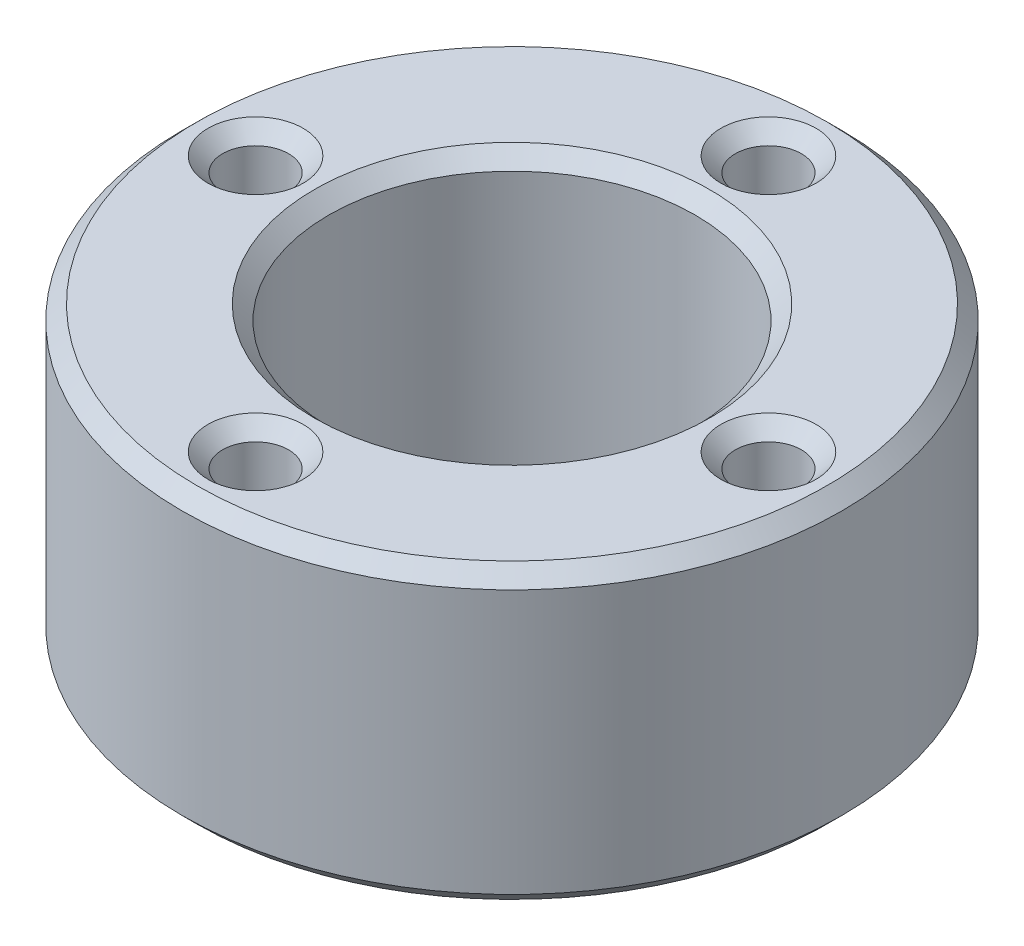
ISO-10303-21;
HEADER;
FILE_DESCRIPTION(('STEP AP214'),'2;1');
FILE_NAME('part.step','',(''),(''),'','','');
FILE_SCHEMA(('AUTOMOTIVE_DESIGN { 1 0 10303 214 1 1 1 1 }'));
ENDSEC;
DATA;
#1=APPLICATION_CONTEXT('core data for automotive mechanical design processes');
#2=APPLICATION_PROTOCOL_DEFINITION('international standard','automotive_design',2000,#1);
#3=PRODUCT_CONTEXT('',#1,'mechanical');
#4=PRODUCT('Part','Part','',(#3));
#5=PRODUCT_RELATED_PRODUCT_CATEGORY('part','',(#4));
#6=PRODUCT_DEFINITION_FORMATION('','',#4);
#7=PRODUCT_DEFINITION_CONTEXT('part definition',#1,'design');
#8=PRODUCT_DEFINITION('design','',#6,#7);
#9=PRODUCT_DEFINITION_SHAPE('','',#8);
#10=(LENGTH_UNIT() NAMED_UNIT(*) SI_UNIT(.MILLI.,.METRE.));
#11=(NAMED_UNIT(*) PLANE_ANGLE_UNIT() SI_UNIT($,.RADIAN.));
#12=(NAMED_UNIT(*) SI_UNIT($,.STERADIAN.) SOLID_ANGLE_UNIT());
#13=UNCERTAINTY_MEASURE_WITH_UNIT(LENGTH_MEASURE(1.E-05),#10,'distance_accuracy_value','');
#14=(GEOMETRIC_REPRESENTATION_CONTEXT(3) GLOBAL_UNCERTAINTY_ASSIGNED_CONTEXT((#13)) GLOBAL_UNIT_ASSIGNED_CONTEXT((#10,
#11,#12)) REPRESENTATION_CONTEXT('',''));
#15=CARTESIAN_POINT('',(0.,0.,0.));
#16=DIRECTION('',(0.,0.,1.));
#17=DIRECTION('',(1.,0.,0.));
#18=AXIS2_PLACEMENT_3D('',#15,#16,#17);
#19=CARTESIAN_POINT('',(0.,20.,0.));
#20=DIRECTION('',(0.,1.,0.));
#21=DIRECTION('',(0.,0.,1.));
#22=AXIS2_PLACEMENT_3D('',#19,#20,#21);
#23=PLANE('',#22);
#24=CARTESIAN_POINT('',(0.,20.,17.5));
#25=DIRECTION('',(0.,1.,0.));
#26=DIRECTION('',(0.,0.,1.));
#27=AXIS2_PLACEMENT_3D('',#24,#25,#26);
#28=CIRCLE('',#27,3.25000000000006);
#29=CARTESIAN_POINT('',(0.,20.,20.7500000000001));
#30=VERTEX_POINT('',#29);
#31=EDGE_CURVE('E10',#30,#30,#28,.F.);
#32=ORIENTED_EDGE('',*,*,#31,.T.);
#33=EDGE_LOOP('',(#32));
#34=FACE_BOUND('',#33,.T.);
#35=CARTESIAN_POINT('',(0.,20.,-17.5));
#36=DIRECTION('',(0.,1.,0.));
#37=DIRECTION('',(0.,0.,1.));
#38=AXIS2_PLACEMENT_3D('',#35,#36,#37);
#39=CIRCLE('',#38,3.25000000000002);
#40=CARTESIAN_POINT('',(0.,20.,-14.25));
#41=VERTEX_POINT('',#40);
#42=EDGE_CURVE('E48',#41,#41,#39,.F.);
#43=ORIENTED_EDGE('',*,*,#42,.T.);
#44=EDGE_LOOP('',(#43));
#45=FACE_BOUND('',#44,.T.);
#46=CARTESIAN_POINT('',(-17.5,20.,0.));
#47=DIRECTION('',(0.,1.,0.));
#48=DIRECTION('',(0.,0.,1.));
#49=AXIS2_PLACEMENT_3D('',#46,#47,#48);
#50=CIRCLE('',#49,3.25);
#51=CARTESIAN_POINT('',(-17.5,20.,3.25));
#52=VERTEX_POINT('',#51);
#53=EDGE_CURVE('E53',#52,#52,#50,.F.);
#54=ORIENTED_EDGE('',*,*,#53,.T.);
#55=EDGE_LOOP('',(#54));
#56=FACE_BOUND('',#55,.T.);
#57=CARTESIAN_POINT('',(0.,20.,0.));
#58=DIRECTION('',(0.,1.,0.));
#59=DIRECTION('',(0.,0.,1.));
#60=AXIS2_PLACEMENT_3D('',#57,#58,#59);
#61=CIRCLE('',#60,21.5);
#62=CARTESIAN_POINT('',(0.,20.,21.5));
#63=VERTEX_POINT('',#62);
#64=EDGE_CURVE('E58',#63,#63,#61,.T.);
#65=ORIENTED_EDGE('',*,*,#64,.T.);
#66=EDGE_LOOP('',(#65));
#67=FACE_BOUND('',#66,.T.);
#68=CARTESIAN_POINT('',(0.,20.,0.));
#69=DIRECTION('',(0.,1.,0.));
#70=DIRECTION('',(0.,0.,1.));
#71=AXIS2_PLACEMENT_3D('',#68,#69,#70);
#72=CIRCLE('',#71,13.5);
#73=CARTESIAN_POINT('',(0.,20.,13.5));
#74=VERTEX_POINT('',#73);
#75=EDGE_CURVE('E64',#74,#74,#72,.F.);
#76=ORIENTED_EDGE('',*,*,#75,.T.);
#77=EDGE_LOOP('',(#76));
#78=FACE_BOUND('',#77,.T.);
#79=CARTESIAN_POINT('',(17.5,20.,1.2220184685951E-13));
#80=DIRECTION('',(0.,1.,0.));
#81=DIRECTION('',(0.,0.,1.));
#82=AXIS2_PLACEMENT_3D('',#79,#80,#81);
#83=CIRCLE('',#82,3.25000000000002);
#84=CARTESIAN_POINT('',(17.5,20.,3.25000000000015));
#85=VERTEX_POINT('',#84);
#86=EDGE_CURVE('E68',#85,#85,#83,.F.);
#87=ORIENTED_EDGE('',*,*,#86,.T.);
#88=EDGE_LOOP('',(#87));
#89=FACE_BOUND('',#88,.T.);
#90=ADVANCED_FACE('F39',(#34,#45,#56,#67,#78,#89),#23,.T.);
#91=CARTESIAN_POINT('',(0.,0.,0.));
#92=DIRECTION('',(0.,1.,0.));
#93=DIRECTION('',(0.,0.,1.));
#94=AXIS2_PLACEMENT_3D('',#91,#92,#93);
#95=PLANE('',#94);
#96=CARTESIAN_POINT('',(0.,0.,17.5));
#97=DIRECTION('',(0.,1.,0.));
#98=DIRECTION('',(0.,0.,1.));
#99=AXIS2_PLACEMENT_3D('',#96,#97,#98);
#100=CIRCLE('',#99,3.25000000000007);
#101=CARTESIAN_POINT('',(0.,0.,20.7500000000001));
#102=VERTEX_POINT('',#101);
#103=EDGE_CURVE('E120',#102,#102,#100,.T.);
#104=ORIENTED_EDGE('',*,*,#103,.T.);
#105=EDGE_LOOP('',(#104));
#106=FACE_BOUND('',#105,.T.);
#107=CARTESIAN_POINT('',(17.5,0.,1.2220184685951E-13));
#108=DIRECTION('',(0.,1.,0.));
#109=DIRECTION('',(0.,0.,1.));
#110=AXIS2_PLACEMENT_3D('',#107,#108,#109);
#111=CIRCLE('',#110,3.25000000000002);
#112=CARTESIAN_POINT('',(17.5,0.,3.25000000000014));
#113=VERTEX_POINT('',#112);
#114=EDGE_CURVE('E124',#113,#113,#111,.T.);
#115=ORIENTED_EDGE('',*,*,#114,.T.);
#116=EDGE_LOOP('',(#115));
#117=FACE_BOUND('',#116,.T.);
#118=CARTESIAN_POINT('',(0.,0.,-17.5));
#119=DIRECTION('',(0.,1.,0.));
#120=DIRECTION('',(0.,0.,1.));
#121=AXIS2_PLACEMENT_3D('',#118,#119,#120);
#122=CIRCLE('',#121,3.25000000000004);
#123=CARTESIAN_POINT('',(0.,0.,-14.25));
#124=VERTEX_POINT('',#123);
#125=EDGE_CURVE('E128',#124,#124,#122,.T.);
#126=ORIENTED_EDGE('',*,*,#125,.T.);
#127=EDGE_LOOP('',(#126));
#128=FACE_BOUND('',#127,.T.);
#129=CARTESIAN_POINT('',(0.,0.,0.));
#130=DIRECTION('',(0.,1.,0.));
#131=DIRECTION('',(0.,0.,1.));
#132=AXIS2_PLACEMENT_3D('',#129,#130,#131);
#133=CIRCLE('',#132,13.5);
#134=CARTESIAN_POINT('',(0.,0.,13.5));
#135=VERTEX_POINT('',#134);
#136=EDGE_CURVE('E132',#135,#135,#133,.T.);
#137=ORIENTED_EDGE('',*,*,#136,.T.);
#138=EDGE_LOOP('',(#137));
#139=FACE_BOUND('',#138,.T.);
#140=CARTESIAN_POINT('',(-17.5,0.,0.));
#141=DIRECTION('',(0.,1.,0.));
#142=DIRECTION('',(0.,0.,1.));
#143=AXIS2_PLACEMENT_3D('',#140,#141,#142);
#144=CIRCLE('',#143,3.25000000000002);
#145=CARTESIAN_POINT('',(-17.5,0.,3.25000000000002));
#146=VERTEX_POINT('',#145);
#147=EDGE_CURVE('E136',#146,#146,#144,.T.);
#148=ORIENTED_EDGE('',*,*,#147,.T.);
#149=EDGE_LOOP('',(#148));
#150=FACE_BOUND('',#149,.T.);
#151=CARTESIAN_POINT('',(0.,0.,0.));
#152=DIRECTION('',(0.,1.,0.));
#153=DIRECTION('',(0.,0.,1.));
#154=AXIS2_PLACEMENT_3D('',#151,#152,#153);
#155=CIRCLE('',#154,21.5);
#156=CARTESIAN_POINT('',(0.,0.,21.5));
#157=VERTEX_POINT('',#156);
#158=EDGE_CURVE('E140',#157,#157,#155,.F.);
#159=ORIENTED_EDGE('',*,*,#158,.T.);
#160=EDGE_LOOP('',(#159));
#161=FACE_BOUND('',#160,.T.);
#162=ADVANCED_FACE('F145',(#106,#117,#128,#139,#150,#161),#95,.F.);
#163=CARTESIAN_POINT('',(0.,20.,0.));
#164=DIRECTION('',(0.,-1.,0.));
#165=DIRECTION('',(0.,0.,-1.));
#166=AXIS2_PLACEMENT_3D('',#163,#164,#165);
#167=CYLINDRICAL_SURFACE('',#166,22.5);
#168=CARTESIAN_POINT('',(0.,1.,0.));
#169=DIRECTION('',(0.,1.,0.));
#170=DIRECTION('',(0.,0.,1.));
#171=AXIS2_PLACEMENT_3D('',#168,#169,#170);
#172=CIRCLE('',#171,22.5);
#173=CARTESIAN_POINT('',(0.,1.,22.5));
#174=VERTEX_POINT('',#173);
#175=EDGE_CURVE('E72',#174,#174,#172,.T.);
#176=ORIENTED_EDGE('',*,*,#175,.T.);
#177=EDGE_LOOP('',(#176));
#178=FACE_BOUND('',#177,.T.);
#179=CARTESIAN_POINT('',(0.,19.,0.));
#180=DIRECTION('',(0.,1.,0.));
#181=DIRECTION('',(0.,0.,1.));
#182=AXIS2_PLACEMENT_3D('',#179,#180,#181);
#183=CIRCLE('',#182,22.5);
#184=CARTESIAN_POINT('',(0.,19.,22.5));
#185=VERTEX_POINT('',#184);
#186=EDGE_CURVE('E76',#185,#185,#183,.F.);
#187=ORIENTED_EDGE('',*,*,#186,.T.);
#188=EDGE_LOOP('',(#187));
#189=FACE_BOUND('',#188,.T.);
#190=ADVANCED_FACE('F155',(#178,#189),#167,.T.);
#191=CARTESIAN_POINT('',(-17.5,20.,0.));
#192=DIRECTION('',(0.,-1.,0.));
#193=DIRECTION('',(0.,0.,-1.));
#194=AXIS2_PLACEMENT_3D('',#191,#192,#193);
#195=CYLINDRICAL_SURFACE('',#194,2.25);
#196=CARTESIAN_POINT('',(-17.5,1.00000000000002,0.));
#197=DIRECTION('',(0.,1.,0.));
#198=DIRECTION('',(0.,0.,1.));
#199=AXIS2_PLACEMENT_3D('',#196,#197,#198);
#200=CIRCLE('',#199,2.25);
#201=CARTESIAN_POINT('',(-17.5,1.00000000000002,2.25));
#202=VERTEX_POINT('',#201);
#203=EDGE_CURVE('E80',#202,#202,#200,.F.);
#204=ORIENTED_EDGE('',*,*,#203,.T.);
#205=EDGE_LOOP('',(#204));
#206=FACE_BOUND('',#205,.T.);
#207=CARTESIAN_POINT('',(-17.5,19.,0.));
#208=DIRECTION('',(0.,1.,0.));
#209=DIRECTION('',(0.,0.,1.));
#210=AXIS2_PLACEMENT_3D('',#207,#208,#209);
#211=CIRCLE('',#210,2.25);
#212=CARTESIAN_POINT('',(-17.5,19.,2.25));
#213=VERTEX_POINT('',#212);
#214=EDGE_CURVE('E84',#213,#213,#211,.T.);
#215=ORIENTED_EDGE('',*,*,#214,.T.);
#216=EDGE_LOOP('',(#215));
#217=FACE_BOUND('',#216,.T.);
#218=ADVANCED_FACE('F158',(#206,#217),#195,.F.);
#219=CARTESIAN_POINT('',(0.,20.,0.));
#220=DIRECTION('',(0.,-1.,0.));
#221=DIRECTION('',(0.,0.,-1.));
#222=AXIS2_PLACEMENT_3D('',#219,#220,#221);
#223=CYLINDRICAL_SURFACE('',#222,12.5);
#224=CARTESIAN_POINT('',(0.,1.00000000000001,0.));
#225=DIRECTION('',(0.,1.,0.));
#226=DIRECTION('',(0.,0.,1.));
#227=AXIS2_PLACEMENT_3D('',#224,#225,#226);
#228=CIRCLE('',#227,12.5);
#229=CARTESIAN_POINT('',(0.,1.00000000000001,12.5));
#230=VERTEX_POINT('',#229);
#231=EDGE_CURVE('E88',#230,#230,#228,.F.);
#232=ORIENTED_EDGE('',*,*,#231,.T.);
#233=EDGE_LOOP('',(#232));
#234=FACE_BOUND('',#233,.T.);
#235=CARTESIAN_POINT('',(0.,19.,0.));
#236=DIRECTION('',(0.,1.,0.));
#237=DIRECTION('',(0.,0.,1.));
#238=AXIS2_PLACEMENT_3D('',#235,#236,#237);
#239=CIRCLE('',#238,12.5);
#240=CARTESIAN_POINT('',(0.,19.,12.5));
#241=VERTEX_POINT('',#240);
#242=EDGE_CURVE('E92',#241,#241,#239,.T.);
#243=ORIENTED_EDGE('',*,*,#242,.T.);
#244=EDGE_LOOP('',(#243));
#245=FACE_BOUND('',#244,.T.);
#246=ADVANCED_FACE('F194',(#234,#245),#223,.F.);
#247=CARTESIAN_POINT('',(0.,20.,-17.5));
#248=DIRECTION('',(0.,-1.,0.));
#249=DIRECTION('',(0.,0.,-1.));
#250=AXIS2_PLACEMENT_3D('',#247,#248,#249);
#251=CYLINDRICAL_SURFACE('',#250,2.25000000000002);
#252=CARTESIAN_POINT('',(0.,1.00000000000002,-17.5));
#253=DIRECTION('',(0.,1.,0.));
#254=DIRECTION('',(0.,0.,1.));
#255=AXIS2_PLACEMENT_3D('',#252,#253,#254);
#256=CIRCLE('',#255,2.25000000000002);
#257=CARTESIAN_POINT('',(0.,1.00000000000002,-15.25));
#258=VERTEX_POINT('',#257);
#259=EDGE_CURVE('E96',#258,#258,#256,.F.);
#260=ORIENTED_EDGE('',*,*,#259,.T.);
#261=EDGE_LOOP('',(#260));
#262=FACE_BOUND('',#261,.T.);
#263=CARTESIAN_POINT('',(0.,19.,-17.5));
#264=DIRECTION('',(0.,1.,0.));
#265=DIRECTION('',(0.,0.,1.));
#266=AXIS2_PLACEMENT_3D('',#263,#264,#265);
#267=CIRCLE('',#266,2.25000000000002);
#268=CARTESIAN_POINT('',(0.,19.,-15.25));
#269=VERTEX_POINT('',#268);
#270=EDGE_CURVE('E100',#269,#269,#267,.T.);
#271=ORIENTED_EDGE('',*,*,#270,.T.);
#272=EDGE_LOOP('',(#271));
#273=FACE_BOUND('',#272,.T.);
#274=ADVANCED_FACE('F184',(#262,#273),#251,.F.);
#275=CARTESIAN_POINT('',(17.5,20.,1.2220184685951E-13));
#276=DIRECTION('',(0.,-1.,0.));
#277=DIRECTION('',(0.,0.,-1.));
#278=AXIS2_PLACEMENT_3D('',#275,#276,#277);
#279=CYLINDRICAL_SURFACE('',#278,2.25);
#280=CARTESIAN_POINT('',(17.5,1.00000000000002,1.2220184685951E-13));
#281=DIRECTION('',(0.,1.,0.));
#282=DIRECTION('',(0.,0.,1.));
#283=AXIS2_PLACEMENT_3D('',#280,#281,#282);
#284=CIRCLE('',#283,2.25);
#285=CARTESIAN_POINT('',(17.5,1.00000000000002,2.25000000000012));
#286=VERTEX_POINT('',#285);
#287=EDGE_CURVE('E104',#286,#286,#284,.F.);
#288=ORIENTED_EDGE('',*,*,#287,.T.);
#289=EDGE_LOOP('',(#288));
#290=FACE_BOUND('',#289,.T.);
#291=CARTESIAN_POINT('',(17.5,19.,1.2220184685951E-13));
#292=DIRECTION('',(0.,1.,0.));
#293=DIRECTION('',(0.,0.,1.));
#294=AXIS2_PLACEMENT_3D('',#291,#292,#293);
#295=CIRCLE('',#294,2.25);
#296=CARTESIAN_POINT('',(17.5,19.,2.25000000000012));
#297=VERTEX_POINT('',#296);
#298=EDGE_CURVE('E108',#297,#297,#295,.T.);
#299=ORIENTED_EDGE('',*,*,#298,.T.);
#300=EDGE_LOOP('',(#299));
#301=FACE_BOUND('',#300,.T.);
#302=ADVANCED_FACE('F181',(#290,#301),#279,.F.);
#303=CARTESIAN_POINT('',(0.,20.,17.5));
#304=DIRECTION('',(0.,-1.,0.));
#305=DIRECTION('',(0.,0.,-1.));
#306=AXIS2_PLACEMENT_3D('',#303,#304,#305);
#307=CYLINDRICAL_SURFACE('',#306,2.25000000000006);
#308=CARTESIAN_POINT('',(0.,1.00000000000001,17.5));
#309=DIRECTION('',(0.,1.,0.));
#310=DIRECTION('',(0.,0.,1.));
#311=AXIS2_PLACEMENT_3D('',#308,#309,#310);
#312=CIRCLE('',#311,2.25000000000006);
#313=CARTESIAN_POINT('',(0.,1.00000000000001,19.7500000000001));
#314=VERTEX_POINT('',#313);
#315=EDGE_CURVE('E112',#314,#314,#312,.F.);
#316=ORIENTED_EDGE('',*,*,#315,.T.);
#317=EDGE_LOOP('',(#316));
#318=FACE_BOUND('',#317,.T.);
#319=CARTESIAN_POINT('',(0.,19.,17.5));
#320=DIRECTION('',(0.,1.,0.));
#321=DIRECTION('',(0.,0.,1.));
#322=AXIS2_PLACEMENT_3D('',#319,#320,#321);
#323=CIRCLE('',#322,2.25000000000006);
#324=CARTESIAN_POINT('',(0.,19.,19.7500000000001));
#325=VERTEX_POINT('',#324);
#326=EDGE_CURVE('E116',#325,#325,#323,.T.);
#327=ORIENTED_EDGE('',*,*,#326,.T.);
#328=EDGE_LOOP('',(#327));
#329=FACE_BOUND('',#328,.T.);
#330=ADVANCED_FACE('F183',(#318,#329),#307,.F.);
#331=CARTESIAN_POINT('',(0.,0.,17.5));
#332=DIRECTION('',(0.,-1.,0.));
#333=DIRECTION('',(0.,0.,-1.));
#334=AXIS2_PLACEMENT_3D('',#331,#332,#333);
#335=CONICAL_SURFACE('',#334,3.25000000000007,0.785398163397449);
#336=ORIENTED_EDGE('',*,*,#315,.F.);
#337=EDGE_LOOP('',(#336));
#338=FACE_BOUND('',#337,.T.);
#339=ORIENTED_EDGE('',*,*,#103,.F.);
#340=EDGE_LOOP('',(#339));
#341=FACE_BOUND('',#340,.T.);
#342=ADVANCED_FACE('F191',(#338,#341),#335,.F.);
#343=CARTESIAN_POINT('',(17.5,0.,1.2220184685951E-13));
#344=DIRECTION('',(0.,-1.,0.));
#345=DIRECTION('',(0.,0.,-1.));
#346=AXIS2_PLACEMENT_3D('',#343,#344,#345);
#347=CONICAL_SURFACE('',#346,3.25000000000002,0.785398163397448);
#348=ORIENTED_EDGE('',*,*,#287,.F.);
#349=EDGE_LOOP('',(#348));
#350=FACE_BOUND('',#349,.T.);
#351=ORIENTED_EDGE('',*,*,#114,.F.);
#352=EDGE_LOOP('',(#351));
#353=FACE_BOUND('',#352,.T.);
#354=ADVANCED_FACE('F213',(#350,#353),#347,.F.);
#355=CARTESIAN_POINT('',(0.,0.,-17.5));
#356=DIRECTION('',(0.,-1.,0.));
#357=DIRECTION('',(0.,0.,-1.));
#358=AXIS2_PLACEMENT_3D('',#355,#356,#357);
#359=CONICAL_SURFACE('',#358,3.25000000000004,0.785398163397448);
#360=ORIENTED_EDGE('',*,*,#259,.F.);
#361=EDGE_LOOP('',(#360));
#362=FACE_BOUND('',#361,.T.);
#363=ORIENTED_EDGE('',*,*,#125,.F.);
#364=EDGE_LOOP('',(#363));
#365=FACE_BOUND('',#364,.T.);
#366=ADVANCED_FACE('F220',(#362,#365),#359,.F.);
#367=CARTESIAN_POINT('',(0.,0.,0.));
#368=DIRECTION('',(0.,-1.,0.));
#369=DIRECTION('',(0.,0.,-1.));
#370=AXIS2_PLACEMENT_3D('',#367,#368,#369);
#371=CONICAL_SURFACE('',#370,13.5,0.785398163397448);
#372=ORIENTED_EDGE('',*,*,#231,.F.);
#373=EDGE_LOOP('',(#372));
#374=FACE_BOUND('',#373,.T.);
#375=ORIENTED_EDGE('',*,*,#136,.F.);
#376=EDGE_LOOP('',(#375));
#377=FACE_BOUND('',#376,.T.);
#378=ADVANCED_FACE('F227',(#374,#377),#371,.F.);
#379=CARTESIAN_POINT('',(-17.5,0.,0.));
#380=DIRECTION('',(0.,-1.,0.));
#381=DIRECTION('',(0.,0.,-1.));
#382=AXIS2_PLACEMENT_3D('',#379,#380,#381);
#383=CONICAL_SURFACE('',#382,3.25000000000002,0.785398163397448);
#384=ORIENTED_EDGE('',*,*,#203,.F.);
#385=EDGE_LOOP('',(#384));
#386=FACE_BOUND('',#385,.T.);
#387=ORIENTED_EDGE('',*,*,#147,.F.);
#388=EDGE_LOOP('',(#387));
#389=FACE_BOUND('',#388,.T.);
#390=ADVANCED_FACE('F151',(#386,#389),#383,.F.);
#391=CARTESIAN_POINT('',(0.,1.,0.));
#392=DIRECTION('',(0.,1.,0.));
#393=DIRECTION('',(0.,0.,1.));
#394=AXIS2_PLACEMENT_3D('',#391,#392,#393);
#395=CONICAL_SURFACE('',#394,22.5,0.785398163397454);
#396=ORIENTED_EDGE('',*,*,#158,.F.);
#397=EDGE_LOOP('',(#396));
#398=FACE_BOUND('',#397,.T.);
#399=ORIENTED_EDGE('',*,*,#175,.F.);
#400=EDGE_LOOP('',(#399));
#401=FACE_BOUND('',#400,.T.);
#402=ADVANCED_FACE('F147',(#398,#401),#395,.T.);
#403=CARTESIAN_POINT('',(0.,19.,17.5));
#404=DIRECTION('',(0.,1.,0.));
#405=DIRECTION('',(0.,0.,1.));
#406=AXIS2_PLACEMENT_3D('',#403,#404,#405);
#407=CONICAL_SURFACE('',#406,2.25000000000006,0.785398163397447);
#408=ORIENTED_EDGE('',*,*,#31,.F.);
#409=EDGE_LOOP('',(#408));
#410=FACE_BOUND('',#409,.T.);
#411=ORIENTED_EDGE('',*,*,#326,.F.);
#412=EDGE_LOOP('',(#411));
#413=FACE_BOUND('',#412,.T.);
#414=ADVANCED_FACE('F150',(#410,#413),#407,.F.);
#415=CARTESIAN_POINT('',(0.,19.,-17.5));
#416=DIRECTION('',(0.,1.,0.));
#417=DIRECTION('',(0.,0.,1.));
#418=AXIS2_PLACEMENT_3D('',#415,#416,#417);
#419=CONICAL_SURFACE('',#418,2.25000000000002,0.785398163397452);
#420=ORIENTED_EDGE('',*,*,#42,.F.);
#421=EDGE_LOOP('',(#420));
#422=FACE_BOUND('',#421,.T.);
#423=ORIENTED_EDGE('',*,*,#270,.F.);
#424=EDGE_LOOP('',(#423));
#425=FACE_BOUND('',#424,.T.);
#426=ADVANCED_FACE('F249',(#422,#425),#419,.F.);
#427=CARTESIAN_POINT('',(-17.5,19.,0.));
#428=DIRECTION('',(0.,1.,0.));
#429=DIRECTION('',(0.,0.,1.));
#430=AXIS2_PLACEMENT_3D('',#427,#428,#429);
#431=CONICAL_SURFACE('',#430,2.25,0.785398163397452);
#432=ORIENTED_EDGE('',*,*,#53,.F.);
#433=EDGE_LOOP('',(#432));
#434=FACE_BOUND('',#433,.T.);
#435=ORIENTED_EDGE('',*,*,#214,.F.);
#436=EDGE_LOOP('',(#435));
#437=FACE_BOUND('',#436,.T.);
#438=ADVANCED_FACE('F166',(#434,#437),#431,.F.);
#439=CARTESIAN_POINT('',(0.,20.,0.));
#440=DIRECTION('',(0.,-1.,0.));
#441=DIRECTION('',(0.,0.,-1.));
#442=AXIS2_PLACEMENT_3D('',#439,#440,#441);
#443=CONICAL_SURFACE('',#442,21.5,0.785398163397445);
#444=ORIENTED_EDGE('',*,*,#186,.F.);
#445=EDGE_LOOP('',(#444));
#446=FACE_BOUND('',#445,.T.);
#447=ORIENTED_EDGE('',*,*,#64,.F.);
#448=EDGE_LOOP('',(#447));
#449=FACE_BOUND('',#448,.T.);
#450=ADVANCED_FACE('F162',(#446,#449),#443,.T.);
#451=CARTESIAN_POINT('',(0.,19.,0.));
#452=DIRECTION('',(0.,1.,0.));
#453=DIRECTION('',(0.,0.,1.));
#454=AXIS2_PLACEMENT_3D('',#451,#452,#453);
#455=CONICAL_SURFACE('',#454,12.5,0.78539816339745);
#456=ORIENTED_EDGE('',*,*,#75,.F.);
#457=EDGE_LOOP('',(#456));
#458=FACE_BOUND('',#457,.T.);
#459=ORIENTED_EDGE('',*,*,#242,.F.);
#460=EDGE_LOOP('',(#459));
#461=FACE_BOUND('',#460,.T.);
#462=ADVANCED_FACE('F165',(#458,#461),#455,.F.);
#463=CARTESIAN_POINT('',(17.5,19.,1.2220184685951E-13));
#464=DIRECTION('',(0.,1.,0.));
#465=DIRECTION('',(0.,0.,1.));
#466=AXIS2_PLACEMENT_3D('',#463,#464,#465);
#467=CONICAL_SURFACE('',#466,2.25,0.785398163397451);
#468=ORIENTED_EDGE('',*,*,#86,.F.);
#469=EDGE_LOOP('',(#468));
#470=FACE_BOUND('',#469,.T.);
#471=ORIENTED_EDGE('',*,*,#298,.F.);
#472=EDGE_LOOP('',(#471));
#473=FACE_BOUND('',#472,.T.);
#474=ADVANCED_FACE('F42',(#470,#473),#467,.F.);
#475=CLOSED_SHELL('',(#90,#162,#190,#218,#246,#274,#302,#330,#342,#354,#366,#378,#390,#402,#414,
#426,#438,#450,#462,#474));
#476=MANIFOLD_SOLID_BREP('B2',#475);
#477=ADVANCED_BREP_SHAPE_REPRESENTATION('',(#18,#476),#14);
#478=SHAPE_DEFINITION_REPRESENTATION(#9,#477);
ENDSEC;
END-ISO-10303-21;
